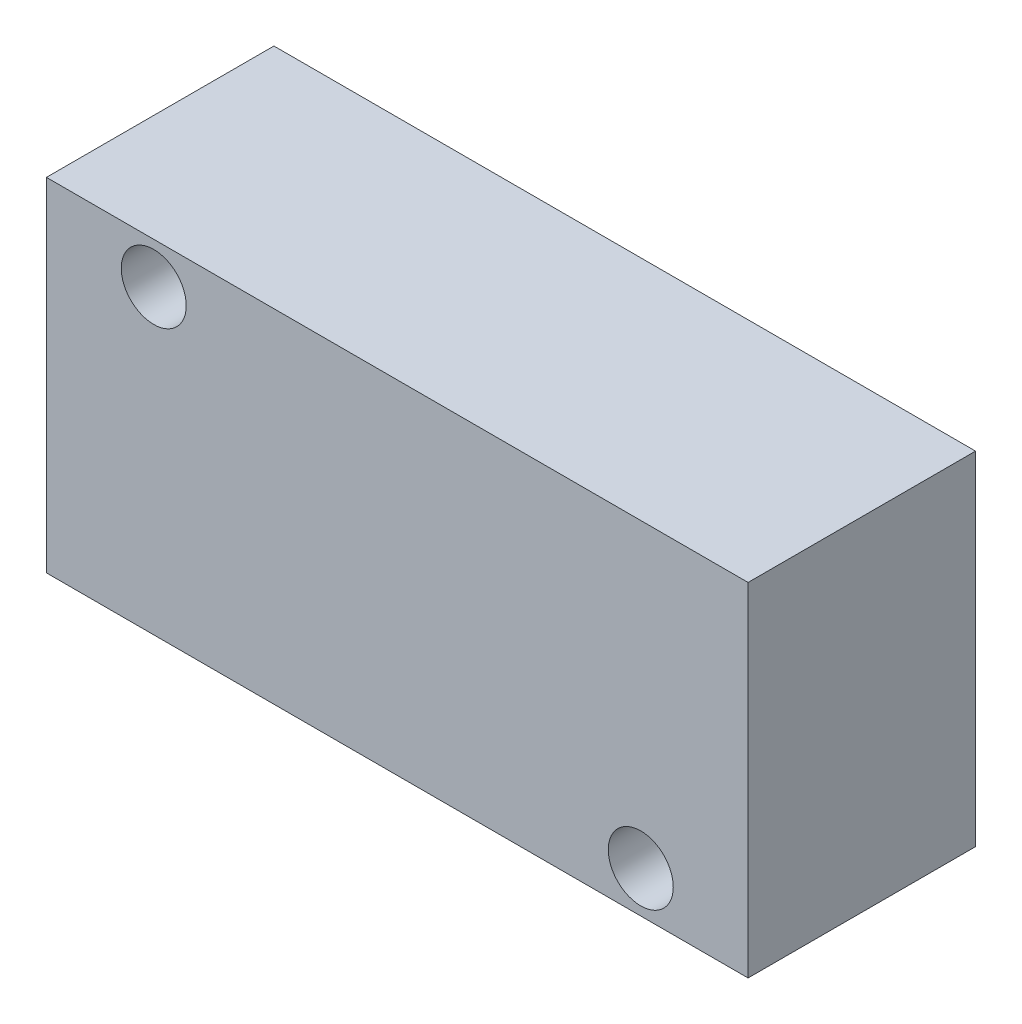
ISO-10303-21;
HEADER;
FILE_DESCRIPTION(('STEP AP214'),'2;1');
FILE_NAME('part.step','',(''),(''),'','','');
FILE_SCHEMA(('AUTOMOTIVE_DESIGN { 1 0 10303 214 1 1 1 1 }'));
ENDSEC;
DATA;
#1=APPLICATION_CONTEXT('core data for automotive mechanical design processes');
#2=APPLICATION_PROTOCOL_DEFINITION('international standard','automotive_design',2000,#1);
#3=PRODUCT_CONTEXT('',#1,'mechanical');
#4=PRODUCT('Part','Part','',(#3));
#5=PRODUCT_RELATED_PRODUCT_CATEGORY('part','',(#4));
#6=PRODUCT_DEFINITION_FORMATION('','',#4);
#7=PRODUCT_DEFINITION_CONTEXT('part definition',#1,'design');
#8=PRODUCT_DEFINITION('design','',#6,#7);
#9=PRODUCT_DEFINITION_SHAPE('','',#8);
#10=(LENGTH_UNIT() NAMED_UNIT(*) SI_UNIT(.MILLI.,.METRE.));
#11=(NAMED_UNIT(*) PLANE_ANGLE_UNIT() SI_UNIT($,.RADIAN.));
#12=(NAMED_UNIT(*) SI_UNIT($,.STERADIAN.) SOLID_ANGLE_UNIT());
#13=UNCERTAINTY_MEASURE_WITH_UNIT(LENGTH_MEASURE(1.E-05),#10,'distance_accuracy_value','');
#14=(GEOMETRIC_REPRESENTATION_CONTEXT(3) GLOBAL_UNCERTAINTY_ASSIGNED_CONTEXT((#13)) GLOBAL_UNIT_ASSIGNED_CONTEXT((#10,
#11,#12)) REPRESENTATION_CONTEXT('',''));
#15=CARTESIAN_POINT('',(0.,0.,0.));
#16=DIRECTION('',(0.,0.,1.));
#17=DIRECTION('',(1.,0.,0.));
#18=AXIS2_PLACEMENT_3D('',#15,#16,#17);
#19=CARTESIAN_POINT('',(-21.59,10.541,14.));
#20=DIRECTION('',(1.,0.,0.));
#21=DIRECTION('',(0.,0.,-1.));
#22=AXIS2_PLACEMENT_3D('',#19,#20,#21);
#23=PLANE('',#22);
#24=DIRECTION('',(0.,-1.,0.));
#25=VECTOR('',#24,1.);
#26=CARTESIAN_POINT('',(-21.59,10.541,0.));
#27=LINE('',#26,#25);
#28=CARTESIAN_POINT('',(-21.59,10.541,0.));
#29=VERTEX_POINT('',#28);
#30=CARTESIAN_POINT('',(-21.59,-10.541,0.));
#31=VERTEX_POINT('',#30);
#32=EDGE_CURVE('E97',#29,#31,#27,.T.);
#33=ORIENTED_EDGE('',*,*,#32,.T.);
#34=DIRECTION('',(0.,0.,-1.));
#35=VECTOR('',#34,1.);
#36=CARTESIAN_POINT('',(-21.59,-10.541,14.));
#37=LINE('',#36,#35);
#38=CARTESIAN_POINT('',(-21.59,-10.541,14.));
#39=VERTEX_POINT('',#38);
#40=EDGE_CURVE('E11',#39,#31,#37,.T.);
#41=ORIENTED_EDGE('',*,*,#40,.F.);
#42=DIRECTION('',(0.,-1.,0.));
#43=VECTOR('',#42,1.);
#44=CARTESIAN_POINT('',(-21.59,10.541,14.));
#45=LINE('',#44,#43);
#46=CARTESIAN_POINT('',(-21.59,10.541,14.));
#47=VERTEX_POINT('',#46);
#48=EDGE_CURVE('E85',#47,#39,#45,.T.);
#49=ORIENTED_EDGE('',*,*,#48,.F.);
#50=DIRECTION('',(0.,0.,-1.));
#51=VECTOR('',#50,1.);
#52=CARTESIAN_POINT('',(-21.59,10.541,14.));
#53=LINE('',#52,#51);
#54=EDGE_CURVE('E93',#47,#29,#53,.T.);
#55=ORIENTED_EDGE('',*,*,#54,.T.);
#56=EDGE_LOOP('',(#33,#41,#49,#55));
#57=FACE_BOUND('',#56,.T.);
#58=ADVANCED_FACE('F34',(#57),#23,.F.);
#59=CARTESIAN_POINT('',(21.59,-10.541,14.));
#60=DIRECTION('',(0.,1.,0.));
#61=DIRECTION('',(-1.,0.,0.));
#62=AXIS2_PLACEMENT_3D('',#59,#60,#61);
#63=PLANE('',#62);
#64=DIRECTION('',(1.,0.,0.));
#65=VECTOR('',#64,1.);
#66=CARTESIAN_POINT('',(21.59,-10.541,0.));
#67=LINE('',#66,#65);
#68=CARTESIAN_POINT('',(21.59,-10.541,0.));
#69=VERTEX_POINT('',#68);
#70=EDGE_CURVE('E89',#31,#69,#67,.T.);
#71=ORIENTED_EDGE('',*,*,#70,.T.);
#72=DIRECTION('',(0.,0.,-1.));
#73=VECTOR('',#72,1.);
#74=CARTESIAN_POINT('',(21.59,-10.541,14.));
#75=LINE('',#74,#73);
#76=CARTESIAN_POINT('',(21.59,-10.541,14.));
#77=VERTEX_POINT('',#76);
#78=EDGE_CURVE('E42',#77,#69,#75,.T.);
#79=ORIENTED_EDGE('',*,*,#78,.F.);
#80=DIRECTION('',(1.,0.,0.));
#81=VECTOR('',#80,1.);
#82=CARTESIAN_POINT('',(21.59,-10.541,14.));
#83=LINE('',#82,#81);
#84=EDGE_CURVE('E80',#39,#77,#83,.T.);
#85=ORIENTED_EDGE('',*,*,#84,.F.);
#86=ORIENTED_EDGE('',*,*,#40,.T.);
#87=EDGE_LOOP('',(#71,#79,#85,#86));
#88=FACE_BOUND('',#87,.T.);
#89=ADVANCED_FACE('F88',(#88),#63,.F.);
#90=CARTESIAN_POINT('',(21.59,10.541,14.));
#91=DIRECTION('',(-1.,0.,0.));
#92=DIRECTION('',(0.,-1.,0.));
#93=AXIS2_PLACEMENT_3D('',#90,#91,#92);
#94=PLANE('',#93);
#95=DIRECTION('',(0.,1.,0.));
#96=VECTOR('',#95,1.);
#97=CARTESIAN_POINT('',(21.59,10.541,0.));
#98=LINE('',#97,#96);
#99=CARTESIAN_POINT('',(21.59,10.541,0.));
#100=VERTEX_POINT('',#99);
#101=EDGE_CURVE('E67',#69,#100,#98,.T.);
#102=ORIENTED_EDGE('',*,*,#101,.T.);
#103=DIRECTION('',(0.,0.,-1.));
#104=VECTOR('',#103,1.);
#105=CARTESIAN_POINT('',(21.59,10.541,14.));
#106=LINE('',#105,#104);
#107=CARTESIAN_POINT('',(21.59,10.541,14.));
#108=VERTEX_POINT('',#107);
#109=EDGE_CURVE('E90',#108,#100,#106,.T.);
#110=ORIENTED_EDGE('',*,*,#109,.F.);
#111=DIRECTION('',(0.,1.,0.));
#112=VECTOR('',#111,1.);
#113=CARTESIAN_POINT('',(21.59,10.541,14.));
#114=LINE('',#113,#112);
#115=EDGE_CURVE('E83',#77,#108,#114,.T.);
#116=ORIENTED_EDGE('',*,*,#115,.F.);
#117=ORIENTED_EDGE('',*,*,#78,.T.);
#118=EDGE_LOOP('',(#102,#110,#116,#117));
#119=FACE_BOUND('',#118,.T.);
#120=ADVANCED_FACE('F91',(#119),#94,.F.);
#121=CARTESIAN_POINT('',(21.59,10.541,14.));
#122=DIRECTION('',(0.,-1.,0.));
#123=DIRECTION('',(1.,0.,0.));
#124=AXIS2_PLACEMENT_3D('',#121,#122,#123);
#125=PLANE('',#124);
#126=DIRECTION('',(-1.,0.,0.));
#127=VECTOR('',#126,1.);
#128=CARTESIAN_POINT('',(21.59,10.541,0.));
#129=LINE('',#128,#127);
#130=EDGE_CURVE('E73',#100,#29,#129,.T.);
#131=ORIENTED_EDGE('',*,*,#130,.T.);
#132=ORIENTED_EDGE('',*,*,#54,.F.);
#133=DIRECTION('',(-1.,0.,0.));
#134=VECTOR('',#133,1.);
#135=CARTESIAN_POINT('',(21.59,10.541,14.));
#136=LINE('',#135,#134);
#137=EDGE_CURVE('E50',#108,#47,#136,.T.);
#138=ORIENTED_EDGE('',*,*,#137,.F.);
#139=ORIENTED_EDGE('',*,*,#109,.T.);
#140=EDGE_LOOP('',(#131,#132,#138,#139));
#141=FACE_BOUND('',#140,.T.);
#142=ADVANCED_FACE('F105',(#141),#125,.F.);
#143=CARTESIAN_POINT('',(0.,0.,14.));
#144=DIRECTION('',(0.,0.,-1.));
#145=DIRECTION('',(-1.,0.,0.));
#146=AXIS2_PLACEMENT_3D('',#143,#144,#145);
#147=PLANE('',#146);
#148=CARTESIAN_POINT('',(14.986,-8.00099999999999,14.));
#149=DIRECTION('',(0.,0.,1.));
#150=DIRECTION('',(1.,0.,0.));
#151=AXIS2_PLACEMENT_3D('',#148,#149,#150);
#152=CIRCLE('',#151,2.);
#153=CARTESIAN_POINT('',(16.986,-8.00099999999999,14.));
#154=VERTEX_POINT('',#153);
#155=EDGE_CURVE('E117',#154,#154,#152,.T.);
#156=ORIENTED_EDGE('',*,*,#155,.F.);
#157=EDGE_LOOP('',(#156));
#158=FACE_BOUND('',#157,.T.);
#159=CARTESIAN_POINT('',(-14.986,8.001,14.));
#160=DIRECTION('',(0.,0.,1.));
#161=DIRECTION('',(1.,0.,0.));
#162=AXIS2_PLACEMENT_3D('',#159,#160,#161);
#163=CIRCLE('',#162,2.);
#164=CARTESIAN_POINT('',(-12.986,8.001,14.));
#165=VERTEX_POINT('',#164);
#166=EDGE_CURVE('E111',#165,#165,#163,.T.);
#167=ORIENTED_EDGE('',*,*,#166,.F.);
#168=EDGE_LOOP('',(#167));
#169=FACE_BOUND('',#168,.T.);
#170=ORIENTED_EDGE('',*,*,#48,.T.);
#171=ORIENTED_EDGE('',*,*,#84,.T.);
#172=ORIENTED_EDGE('',*,*,#115,.T.);
#173=ORIENTED_EDGE('',*,*,#137,.T.);
#174=EDGE_LOOP('',(#170,#171,#172,#173));
#175=FACE_BOUND('',#174,.T.);
#176=ADVANCED_FACE('F81',(#158,#169,#175),#147,.F.);
#177=CARTESIAN_POINT('',(0.,0.,0.));
#178=DIRECTION('',(0.,0.,-1.));
#179=DIRECTION('',(-1.,0.,0.));
#180=AXIS2_PLACEMENT_3D('',#177,#178,#179);
#181=PLANE('',#180);
#182=CARTESIAN_POINT('',(14.986,-8.00099999999999,0.));
#183=DIRECTION('',(0.,0.,1.));
#184=DIRECTION('',(1.,0.,0.));
#185=AXIS2_PLACEMENT_3D('',#182,#183,#184);
#186=CIRCLE('',#185,2.);
#187=CARTESIAN_POINT('',(16.986,-8.00099999999999,0.));
#188=VERTEX_POINT('',#187);
#189=EDGE_CURVE('E114',#188,#188,#186,.T.);
#190=ORIENTED_EDGE('',*,*,#189,.T.);
#191=EDGE_LOOP('',(#190));
#192=FACE_BOUND('',#191,.T.);
#193=CARTESIAN_POINT('',(-14.986,8.001,0.));
#194=DIRECTION('',(0.,0.,1.));
#195=DIRECTION('',(1.,0.,0.));
#196=AXIS2_PLACEMENT_3D('',#193,#194,#195);
#197=CIRCLE('',#196,2.);
#198=CARTESIAN_POINT('',(-12.986,8.001,0.));
#199=VERTEX_POINT('',#198);
#200=EDGE_CURVE('E100',#199,#199,#197,.T.);
#201=ORIENTED_EDGE('',*,*,#200,.T.);
#202=EDGE_LOOP('',(#201));
#203=FACE_BOUND('',#202,.T.);
#204=ORIENTED_EDGE('',*,*,#32,.F.);
#205=ORIENTED_EDGE('',*,*,#130,.F.);
#206=ORIENTED_EDGE('',*,*,#101,.F.);
#207=ORIENTED_EDGE('',*,*,#70,.F.);
#208=EDGE_LOOP('',(#204,#205,#206,#207));
#209=FACE_BOUND('',#208,.T.);
#210=ADVANCED_FACE('F108',(#192,#203,#209),#181,.T.);
#211=CARTESIAN_POINT('',(-14.986,8.001,0.));
#212=DIRECTION('',(0.,0.,1.));
#213=DIRECTION('',(1.,0.,0.));
#214=AXIS2_PLACEMENT_3D('',#211,#212,#213);
#215=CYLINDRICAL_SURFACE('',#214,2.);
#216=ORIENTED_EDGE('',*,*,#200,.F.);
#217=EDGE_LOOP('',(#216));
#218=FACE_BOUND('',#217,.T.);
#219=ORIENTED_EDGE('',*,*,#166,.T.);
#220=EDGE_LOOP('',(#219));
#221=FACE_BOUND('',#220,.T.);
#222=ADVANCED_FACE('F128',(#218,#221),#215,.F.);
#223=CARTESIAN_POINT('',(14.986,-8.00099999999999,0.));
#224=DIRECTION('',(0.,0.,1.));
#225=DIRECTION('',(1.,0.,0.));
#226=AXIS2_PLACEMENT_3D('',#223,#224,#225);
#227=CYLINDRICAL_SURFACE('',#226,2.);
#228=ORIENTED_EDGE('',*,*,#189,.F.);
#229=EDGE_LOOP('',(#228));
#230=FACE_BOUND('',#229,.T.);
#231=ORIENTED_EDGE('',*,*,#155,.T.);
#232=EDGE_LOOP('',(#231));
#233=FACE_BOUND('',#232,.T.);
#234=ADVANCED_FACE('F125',(#230,#233),#227,.F.);
#235=CLOSED_SHELL('',(#58,#89,#120,#142,#176,#210,#222,#234));
#236=MANIFOLD_SOLID_BREP('B2',#235);
#237=ADVANCED_BREP_SHAPE_REPRESENTATION('',(#18,#236),#14);
#238=SHAPE_DEFINITION_REPRESENTATION(#9,#237);
ENDSEC;
END-ISO-10303-21;
